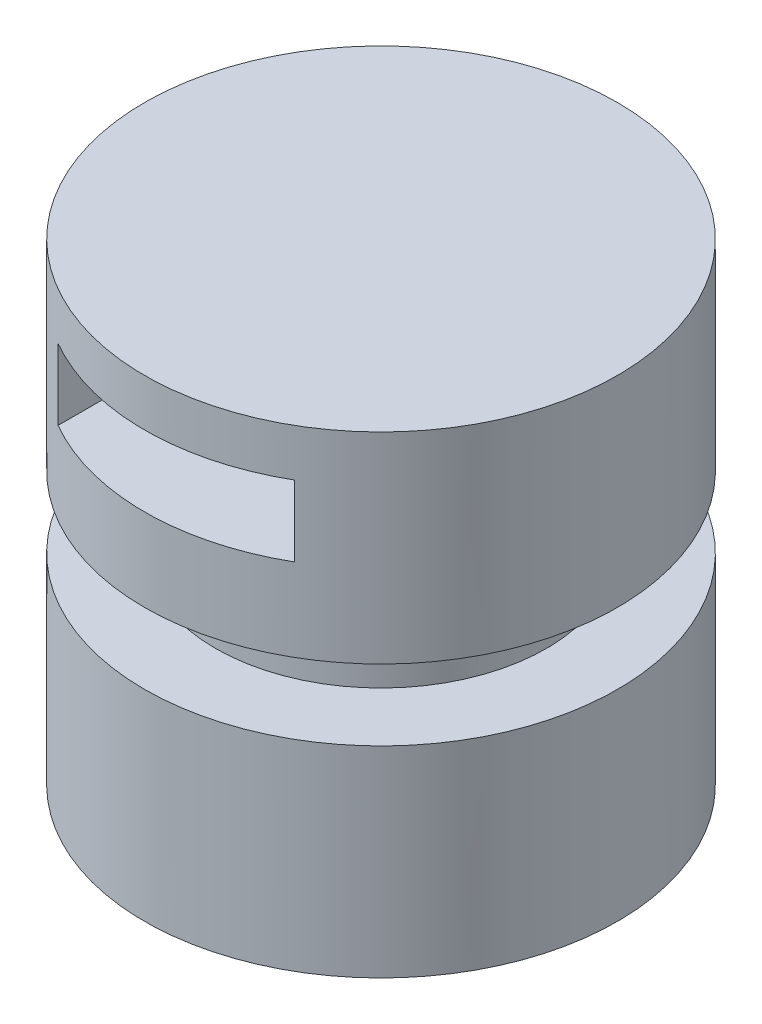
ISO-10303-21;
HEADER;
FILE_DESCRIPTION(('STEP AP214'),'2;1');
FILE_NAME('part.step','',(''),(''),'','','');
FILE_SCHEMA(('AUTOMOTIVE_DESIGN { 1 0 10303 214 1 1 1 1 }'));
ENDSEC;
DATA;
#1=APPLICATION_CONTEXT('core data for automotive mechanical design processes');
#2=APPLICATION_PROTOCOL_DEFINITION('international standard','automotive_design',2000,#1);
#3=PRODUCT_CONTEXT('',#1,'mechanical');
#4=PRODUCT('Part','Part','',(#3));
#5=PRODUCT_RELATED_PRODUCT_CATEGORY('part','',(#4));
#6=PRODUCT_DEFINITION_FORMATION('','',#4);
#7=PRODUCT_DEFINITION_CONTEXT('part definition',#1,'design');
#8=PRODUCT_DEFINITION('design','',#6,#7);
#9=PRODUCT_DEFINITION_SHAPE('','',#8);
#10=(LENGTH_UNIT() NAMED_UNIT(*) SI_UNIT(.MILLI.,.METRE.));
#11=(NAMED_UNIT(*) PLANE_ANGLE_UNIT() SI_UNIT($,.RADIAN.));
#12=(NAMED_UNIT(*) SI_UNIT($,.STERADIAN.) SOLID_ANGLE_UNIT());
#13=UNCERTAINTY_MEASURE_WITH_UNIT(LENGTH_MEASURE(1.E-05),#10,'distance_accuracy_value','');
#14=(GEOMETRIC_REPRESENTATION_CONTEXT(3) GLOBAL_UNCERTAINTY_ASSIGNED_CONTEXT((#13)) GLOBAL_UNIT_ASSIGNED_CONTEXT((#10,
#11,#12)) REPRESENTATION_CONTEXT('',''));
#15=CARTESIAN_POINT('',(0.,0.,0.));
#16=DIRECTION('',(0.,0.,1.));
#17=DIRECTION('',(1.,0.,0.));
#18=AXIS2_PLACEMENT_3D('',#15,#16,#17);
#19=CARTESIAN_POINT('',(0.,0.,0.));
#20=DIRECTION('',(0.,-1.,0.));
#21=DIRECTION('',(0.,0.,-1.));
#22=AXIS2_PLACEMENT_3D('',#19,#20,#21);
#23=CYLINDRICAL_SURFACE('',#22,100.);
#24=DIRECTION('',(0.,-1.,0.));
#25=VECTOR('',#24,1.);
#26=CARTESIAN_POINT('',(-50.,0.,-86.6025403784439));
#27=LINE('',#26,#25);
#28=CARTESIAN_POINT('',(-50.,150.,-86.6025403784439));
#29=VERTEX_POINT('',#28);
#30=CARTESIAN_POINT('',(-50.,180.,-86.6025403784439));
#31=VERTEX_POINT('',#30);
#32=EDGE_CURVE('E11',#29,#31,#27,.F.);
#33=ORIENTED_EDGE('',*,*,#32,.F.);
#34=CARTESIAN_POINT('',(0.,150.,0.));
#35=DIRECTION('',(0.,-1.,0.));
#36=DIRECTION('',(0.,0.,-1.));
#37=AXIS2_PLACEMENT_3D('',#34,#35,#36);
#38=CIRCLE('',#37,100.);
#39=CARTESIAN_POINT('',(50.,150.,-86.6025403784439));
#40=VERTEX_POINT('',#39);
#41=EDGE_CURVE('E98',#40,#29,#38,.F.);
#42=ORIENTED_EDGE('',*,*,#41,.F.);
#43=DIRECTION('',(0.,-1.,0.));
#44=VECTOR('',#43,1.);
#45=CARTESIAN_POINT('',(50.,0.,-86.6025403784439));
#46=LINE('',#45,#44);
#47=CARTESIAN_POINT('',(50.,180.,-86.6025403784439));
#48=VERTEX_POINT('',#47);
#49=EDGE_CURVE('E103',#48,#40,#46,.T.);
#50=ORIENTED_EDGE('',*,*,#49,.F.);
#51=CARTESIAN_POINT('',(0.,180.,0.));
#52=DIRECTION('',(0.,1.,0.));
#53=DIRECTION('',(0.,0.,1.));
#54=AXIS2_PLACEMENT_3D('',#51,#52,#53);
#55=CIRCLE('',#54,100.);
#56=EDGE_CURVE('E53',#31,#48,#55,.F.);
#57=ORIENTED_EDGE('',*,*,#56,.F.);
#58=EDGE_LOOP('',(#33,#42,#50,#57));
#59=FACE_BOUND('',#58,.T.);
#60=CARTESIAN_POINT('',(-50.,150.,86.6025403784439));
#61=VERTEX_POINT('',#60);
#62=CARTESIAN_POINT('',(50.,150.,86.6025403784439));
#63=VERTEX_POINT('',#62);
#64=EDGE_CURVE('E86',#61,#63,#38,.F.);
#65=ORIENTED_EDGE('',*,*,#64,.F.);
#66=DIRECTION('',(0.,-1.,0.));
#67=VECTOR('',#66,1.);
#68=CARTESIAN_POINT('',(-50.,0.,86.6025403784439));
#69=LINE('',#68,#67);
#70=CARTESIAN_POINT('',(-50.,180.,86.6025403784439));
#71=VERTEX_POINT('',#70);
#72=EDGE_CURVE('E112',#71,#61,#69,.T.);
#73=ORIENTED_EDGE('',*,*,#72,.F.);
#74=CARTESIAN_POINT('',(50.,180.,86.6025403784439));
#75=VERTEX_POINT('',#74);
#76=EDGE_CURVE('E68',#75,#71,#55,.F.);
#77=ORIENTED_EDGE('',*,*,#76,.F.);
#78=DIRECTION('',(0.,-1.,0.));
#79=VECTOR('',#78,1.);
#80=CARTESIAN_POINT('',(50.,0.,86.6025403784439));
#81=LINE('',#80,#79);
#82=EDGE_CURVE('E95',#63,#75,#81,.F.);
#83=ORIENTED_EDGE('',*,*,#82,.F.);
#84=EDGE_LOOP('',(#65,#73,#77,#83));
#85=FACE_BOUND('',#84,.T.);
#86=CARTESIAN_POINT('',(0.,200.,0.));
#87=DIRECTION('',(0.,-1.,0.));
#88=DIRECTION('',(0.,0.,-1.));
#89=AXIS2_PLACEMENT_3D('',#86,#87,#88);
#90=CIRCLE('',#89,100.);
#91=CARTESIAN_POINT('',(0.,200.,-100.));
#92=VERTEX_POINT('',#91);
#93=EDGE_CURVE('E149',#92,#92,#90,.T.);
#94=ORIENTED_EDGE('',*,*,#93,.T.);
#95=EDGE_LOOP('',(#94));
#96=FACE_BOUND('',#95,.T.);
#97=CARTESIAN_POINT('',(0.,115.,0.));
#98=DIRECTION('',(0.,1.,0.));
#99=DIRECTION('',(0.,0.,1.));
#100=AXIS2_PLACEMENT_3D('',#97,#98,#99);
#101=CIRCLE('',#100,100.);
#102=CARTESIAN_POINT('',(0.,115.,100.));
#103=VERTEX_POINT('',#102);
#104=EDGE_CURVE('E145',#103,#103,#101,.T.);
#105=ORIENTED_EDGE('',*,*,#104,.T.);
#106=EDGE_LOOP('',(#105));
#107=FACE_BOUND('',#106,.T.);
#108=ADVANCED_FACE('F45',(#59,#85,#96,#107),#23,.T.);
#109=CARTESIAN_POINT('',(0.,200.,0.));
#110=DIRECTION('',(0.,1.,0.));
#111=DIRECTION('',(0.,0.,1.));
#112=AXIS2_PLACEMENT_3D('',#109,#110,#111);
#113=PLANE('',#112);
#114=ORIENTED_EDGE('',*,*,#93,.F.);
#115=EDGE_LOOP('',(#114));
#116=FACE_BOUND('',#115,.T.);
#117=ADVANCED_FACE('F178',(#116),#113,.T.);
#118=CARTESIAN_POINT('',(0.,115.,-70.));
#119=DIRECTION('',(0.,-1.,0.));
#120=DIRECTION('',(0.,0.,-1.));
#121=AXIS2_PLACEMENT_3D('',#118,#119,#120);
#122=PLANE('',#121);
#123=CARTESIAN_POINT('',(0.,115.,0.));
#124=DIRECTION('',(0.,1.,0.));
#125=DIRECTION('',(0.,0.,1.));
#126=AXIS2_PLACEMENT_3D('',#123,#124,#125);
#127=CIRCLE('',#126,70.);
#128=CARTESIAN_POINT('',(0.,115.,70.));
#129=VERTEX_POINT('',#128);
#130=EDGE_CURVE('E141',#129,#129,#127,.T.);
#131=ORIENTED_EDGE('',*,*,#130,.T.);
#132=EDGE_LOOP('',(#131));
#133=FACE_BOUND('',#132,.T.);
#134=ORIENTED_EDGE('',*,*,#104,.F.);
#135=EDGE_LOOP('',(#134));
#136=FACE_BOUND('',#135,.T.);
#137=ADVANCED_FACE('F172',(#133,#136),#122,.T.);
#138=CARTESIAN_POINT('',(0.,200.,0.));
#139=DIRECTION('',(0.,1.,0.));
#140=DIRECTION('',(0.,0.,1.));
#141=AXIS2_PLACEMENT_3D('',#138,#139,#140);
#142=CYLINDRICAL_SURFACE('',#141,70.);
#143=CARTESIAN_POINT('',(0.,85.0000000000001,0.));
#144=DIRECTION('',(0.,1.,0.));
#145=DIRECTION('',(0.,0.,1.));
#146=AXIS2_PLACEMENT_3D('',#143,#144,#145);
#147=CIRCLE('',#146,70.);
#148=CARTESIAN_POINT('',(0.,85.0000000000001,70.));
#149=VERTEX_POINT('',#148);
#150=EDGE_CURVE('E137',#149,#149,#147,.T.);
#151=ORIENTED_EDGE('',*,*,#150,.T.);
#152=EDGE_LOOP('',(#151));
#153=FACE_BOUND('',#152,.T.);
#154=ORIENTED_EDGE('',*,*,#130,.F.);
#155=EDGE_LOOP('',(#154));
#156=FACE_BOUND('',#155,.T.);
#157=ADVANCED_FACE('F166',(#153,#156),#142,.T.);
#158=CARTESIAN_POINT('',(0.,85.,-70.));
#159=DIRECTION('',(0.,1.,0.));
#160=DIRECTION('',(0.,0.,1.));
#161=AXIS2_PLACEMENT_3D('',#158,#159,#160);
#162=PLANE('',#161);
#163=CARTESIAN_POINT('',(0.,85.,0.));
#164=DIRECTION('',(0.,1.,0.));
#165=DIRECTION('',(0.,0.,1.));
#166=AXIS2_PLACEMENT_3D('',#163,#164,#165);
#167=CIRCLE('',#166,100.);
#168=CARTESIAN_POINT('',(0.,85.,100.));
#169=VERTEX_POINT('',#168);
#170=EDGE_CURVE('E131',#169,#169,#167,.T.);
#171=ORIENTED_EDGE('',*,*,#170,.T.);
#172=EDGE_LOOP('',(#171));
#173=FACE_BOUND('',#172,.T.);
#174=ORIENTED_EDGE('',*,*,#150,.F.);
#175=EDGE_LOOP('',(#174));
#176=FACE_BOUND('',#175,.T.);
#177=ADVANCED_FACE('F163',(#173,#176),#162,.T.);
#178=CARTESIAN_POINT('',(0.,0.,0.));
#179=DIRECTION('',(0.,-1.,0.));
#180=DIRECTION('',(0.,0.,-1.));
#181=AXIS2_PLACEMENT_3D('',#178,#179,#180);
#182=PLANE('',#181);
#183=CARTESIAN_POINT('',(0.,0.,0.));
#184=DIRECTION('',(0.,-1.,0.));
#185=DIRECTION('',(0.,0.,-1.));
#186=AXIS2_PLACEMENT_3D('',#183,#184,#185);
#187=CIRCLE('',#186,100.);
#188=CARTESIAN_POINT('',(0.,0.,-100.));
#189=VERTEX_POINT('',#188);
#190=EDGE_CURVE('E96',#189,#189,#187,.T.);
#191=ORIENTED_EDGE('',*,*,#190,.T.);
#192=EDGE_LOOP('',(#191));
#193=FACE_BOUND('',#192,.T.);
#194=ADVANCED_FACE('F156',(#193),#182,.T.);
#195=ORIENTED_EDGE('',*,*,#190,.F.);
#196=EDGE_LOOP('',(#195));
#197=FACE_BOUND('',#196,.T.);
#198=ORIENTED_EDGE('',*,*,#170,.F.);
#199=EDGE_LOOP('',(#198));
#200=FACE_BOUND('',#199,.T.);
#201=ADVANCED_FACE('F158',(#197,#200),#23,.T.);
#202=CARTESIAN_POINT('',(-50.,180.,-100.));
#203=DIRECTION('',(-1.,0.,0.));
#204=DIRECTION('',(0.,0.,1.));
#205=AXIS2_PLACEMENT_3D('',#202,#203,#204);
#206=PLANE('',#205);
#207=ORIENTED_EDGE('',*,*,#32,.T.);
#208=DIRECTION('',(0.,0.,1.));
#209=VECTOR('',#208,1.);
#210=CARTESIAN_POINT('',(-50.,180.,-100.));
#211=LINE('',#210,#209);
#212=EDGE_CURVE('E127',#31,#71,#211,.T.);
#213=ORIENTED_EDGE('',*,*,#212,.T.);
#214=ORIENTED_EDGE('',*,*,#72,.T.);
#215=DIRECTION('',(0.,0.,1.));
#216=VECTOR('',#215,1.);
#217=CARTESIAN_POINT('',(-50.,150.,-100.));
#218=LINE('',#217,#216);
#219=EDGE_CURVE('E89',#29,#61,#218,.T.);
#220=ORIENTED_EDGE('',*,*,#219,.F.);
#221=EDGE_LOOP('',(#207,#213,#214,#220));
#222=FACE_BOUND('',#221,.T.);
#223=ADVANCED_FACE('F123',(#222),#206,.F.);
#224=CARTESIAN_POINT('',(-50.,180.,-100.));
#225=DIRECTION('',(0.,1.,0.));
#226=DIRECTION('',(0.,0.,1.));
#227=AXIS2_PLACEMENT_3D('',#224,#225,#226);
#228=PLANE('',#227);
#229=ORIENTED_EDGE('',*,*,#212,.F.);
#230=ORIENTED_EDGE('',*,*,#56,.T.);
#231=DIRECTION('',(0.,0.,1.));
#232=VECTOR('',#231,1.);
#233=CARTESIAN_POINT('',(50.,180.,-100.));
#234=LINE('',#233,#232);
#235=EDGE_CURVE('E106',#48,#75,#234,.T.);
#236=ORIENTED_EDGE('',*,*,#235,.T.);
#237=ORIENTED_EDGE('',*,*,#76,.T.);
#238=EDGE_LOOP('',(#229,#230,#236,#237));
#239=FACE_BOUND('',#238,.T.);
#240=ADVANCED_FACE('F126',(#239),#228,.F.);
#241=CARTESIAN_POINT('',(50.,180.,-100.));
#242=DIRECTION('',(1.,0.,0.));
#243=DIRECTION('',(0.,0.,-1.));
#244=AXIS2_PLACEMENT_3D('',#241,#242,#243);
#245=PLANE('',#244);
#246=ORIENTED_EDGE('',*,*,#82,.T.);
#247=ORIENTED_EDGE('',*,*,#235,.F.);
#248=ORIENTED_EDGE('',*,*,#49,.T.);
#249=DIRECTION('',(0.,0.,1.));
#250=VECTOR('',#249,1.);
#251=CARTESIAN_POINT('',(50.,150.,-100.));
#252=LINE('',#251,#250);
#253=EDGE_CURVE('E60',#40,#63,#252,.T.);
#254=ORIENTED_EDGE('',*,*,#253,.T.);
#255=EDGE_LOOP('',(#246,#247,#248,#254));
#256=FACE_BOUND('',#255,.T.);
#257=ADVANCED_FACE('F100',(#256),#245,.F.);
#258=CARTESIAN_POINT('',(-50.,150.,-100.));
#259=DIRECTION('',(0.,-1.,0.));
#260=DIRECTION('',(0.,0.,-1.));
#261=AXIS2_PLACEMENT_3D('',#258,#259,#260);
#262=PLANE('',#261);
#263=ORIENTED_EDGE('',*,*,#219,.T.);
#264=ORIENTED_EDGE('',*,*,#64,.T.);
#265=ORIENTED_EDGE('',*,*,#253,.F.);
#266=ORIENTED_EDGE('',*,*,#41,.T.);
#267=EDGE_LOOP('',(#263,#264,#265,#266));
#268=FACE_BOUND('',#267,.T.);
#269=ADVANCED_FACE('F87',(#268),#262,.F.);
#270=CLOSED_SHELL('',(#108,#117,#137,#157,#177,#194,#201,#223,#240,#257,#269));
#271=MANIFOLD_SOLID_BREP('B2',#270);
#272=ADVANCED_BREP_SHAPE_REPRESENTATION('',(#18,#271),#14);
#273=SHAPE_DEFINITION_REPRESENTATION(#9,#272);
ENDSEC;
END-ISO-10303-21;
